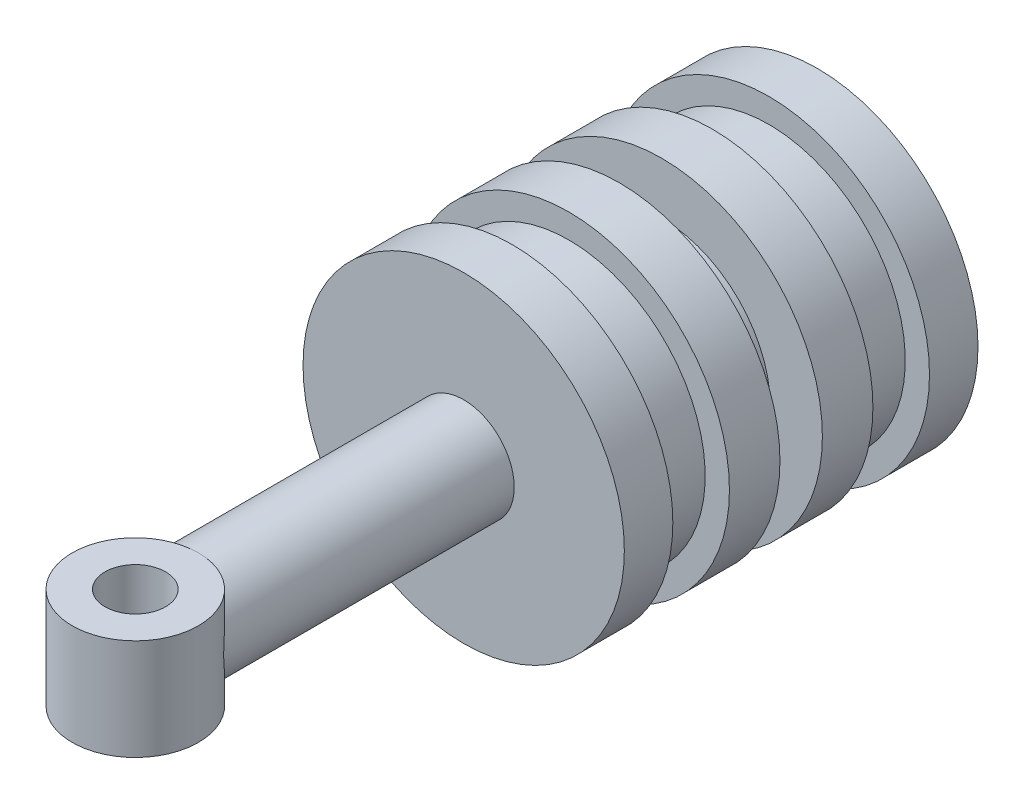
ISO-10303-21;
HEADER;
FILE_DESCRIPTION(('STEP AP214'),'2;1');
FILE_NAME('part.step','',(''),(''),'','','');
FILE_SCHEMA(('AUTOMOTIVE_DESIGN { 1 0 10303 214 1 1 1 1 }'));
ENDSEC;
DATA;
#1=APPLICATION_CONTEXT('core data for automotive mechanical design processes');
#2=APPLICATION_PROTOCOL_DEFINITION('international standard','automotive_design',2000,#1);
#3=PRODUCT_CONTEXT('',#1,'mechanical');
#4=PRODUCT('Part','Part','',(#3));
#5=PRODUCT_RELATED_PRODUCT_CATEGORY('part','',(#4));
#6=PRODUCT_DEFINITION_FORMATION('','',#4);
#7=PRODUCT_DEFINITION_CONTEXT('part definition',#1,'design');
#8=PRODUCT_DEFINITION('design','',#6,#7);
#9=PRODUCT_DEFINITION_SHAPE('','',#8);
#10=(LENGTH_UNIT() NAMED_UNIT(*) SI_UNIT(.MILLI.,.METRE.));
#11=(NAMED_UNIT(*) PLANE_ANGLE_UNIT() SI_UNIT($,.RADIAN.));
#12=(NAMED_UNIT(*) SI_UNIT($,.STERADIAN.) SOLID_ANGLE_UNIT());
#13=UNCERTAINTY_MEASURE_WITH_UNIT(LENGTH_MEASURE(1.E-05),#10,'distance_accuracy_value','');
#14=(GEOMETRIC_REPRESENTATION_CONTEXT(3) GLOBAL_UNCERTAINTY_ASSIGNED_CONTEXT((#13)) GLOBAL_UNIT_ASSIGNED_CONTEXT((#10,
#11,#12)) REPRESENTATION_CONTEXT('',''));
#15=CARTESIAN_POINT('',(0.,0.,0.));
#16=DIRECTION('',(0.,0.,1.));
#17=DIRECTION('',(1.,0.,0.));
#18=AXIS2_PLACEMENT_3D('',#15,#16,#17);
#19=CARTESIAN_POINT('',(0.,0.,35.));
#20=DIRECTION('',(0.,0.,-1.));
#21=DIRECTION('',(-1.,0.,0.));
#22=AXIS2_PLACEMENT_3D('',#19,#20,#21);
#23=CYLINDRICAL_SURFACE('',#22,15.9);
#24=CARTESIAN_POINT('',(0.,0.,30.2));
#25=DIRECTION('',(0.,0.,-1.));
#26=DIRECTION('',(-1.,0.,0.));
#27=AXIS2_PLACEMENT_3D('',#24,#25,#26);
#28=CIRCLE('',#27,15.9);
#29=CARTESIAN_POINT('',(-15.9,0.,30.2));
#30=VERTEX_POINT('',#29);
#31=EDGE_CURVE('E86',#30,#30,#28,.T.);
#32=ORIENTED_EDGE('',*,*,#31,.F.);
#33=EDGE_LOOP('',(#32));
#34=FACE_BOUND('',#33,.T.);
#35=CARTESIAN_POINT('',(0.,0.,35.));
#36=DIRECTION('',(0.,0.,1.));
#37=DIRECTION('',(1.,0.,0.));
#38=AXIS2_PLACEMENT_3D('',#35,#36,#37);
#39=CIRCLE('',#38,15.9);
#40=CARTESIAN_POINT('',(15.9,0.,35.));
#41=VERTEX_POINT('',#40);
#42=EDGE_CURVE('E59',#41,#41,#39,.T.);
#43=ORIENTED_EDGE('',*,*,#42,.F.);
#44=EDGE_LOOP('',(#43));
#45=FACE_BOUND('',#44,.T.);
#46=ADVANCED_FACE('F33',(#34,#45),#23,.T.);
#47=CARTESIAN_POINT('',(0.,0.,35.));
#48=DIRECTION('',(0.,0.,1.));
#49=DIRECTION('',(1.,0.,0.));
#50=AXIS2_PLACEMENT_3D('',#47,#48,#49);
#51=PLANE('',#50);
#52=CARTESIAN_POINT('',(0.,0.,35.));
#53=DIRECTION('',(0.,0.,1.));
#54=DIRECTION('',(1.,0.,0.));
#55=AXIS2_PLACEMENT_3D('',#52,#53,#54);
#56=CIRCLE('',#55,5.);
#57=CARTESIAN_POINT('',(5.,0.,35.));
#58=VERTEX_POINT('',#57);
#59=EDGE_CURVE('E66',#58,#58,#56,.T.);
#60=ORIENTED_EDGE('',*,*,#59,.F.);
#61=EDGE_LOOP('',(#60));
#62=FACE_BOUND('',#61,.T.);
#63=ORIENTED_EDGE('',*,*,#42,.T.);
#64=EDGE_LOOP('',(#63));
#65=FACE_BOUND('',#64,.T.);
#66=ADVANCED_FACE('F129',(#62,#65),#51,.T.);
#67=CARTESIAN_POINT('',(0.,0.,67.5));
#68=DIRECTION('',(0.,0.,-1.));
#69=DIRECTION('',(-1.,0.,0.));
#70=AXIS2_PLACEMENT_3D('',#67,#68,#69);
#71=CYLINDRICAL_SURFACE('',#70,5.);
#72=CARTESIAN_POINT('',(-5.,0.,63.75));
#73=CARTESIAN_POINT('',(-4.99999885776854,0.0938909121280883,63.7499973081609));
#74=CARTESIAN_POINT('',(-4.99734670933994,0.187818115057777,63.7464529538053));
#75=CARTESIAN_POINT('',(-4.98680893324889,0.374886191730902,63.7324675951416));
#76=CARTESIAN_POINT('',(-4.97891973687977,0.468026485386342,63.7220218880348));
#77=CARTESIAN_POINT('',(-4.9475977459603,0.745595294992632,63.6809642800992));
#78=CARTESIAN_POINT('',(-4.91651163359721,0.927784313885939,63.6406350111067));
#79=CARTESIAN_POINT('',(-4.82220555967727,1.34411299218025,63.5230538504446));
#80=CARTESIAN_POINT('',(-4.75156184089542,1.57422595928289,63.437832009276));
#81=CARTESIAN_POINT('',(-4.62456467956746,1.90457082100912,63.2952370729818));
#82=CARTESIAN_POINT('',(-4.57862927978183,2.01238855334762,63.2451455878447));
#83=CARTESIAN_POINT('',(-4.48005171018718,2.22321042709765,63.1414753582653));
#84=CARTESIAN_POINT('',(-4.42740971059429,2.32621469058625,63.0878967023456));
#85=CARTESIAN_POINT('',(-4.29548894563003,2.56385500503684,62.9587890723642));
#86=CARTESIAN_POINT('',(-4.21346186289867,2.69645950010586,62.8823290393125));
#87=CARTESIAN_POINT('',(-4.03784646504337,2.95295736189495,62.7280005243627));
#88=CARTESIAN_POINT('',(-3.9442540003352,3.07684757682343,62.6501315455475));
#89=CARTESIAN_POINT('',(-3.74576821400209,3.31561348088606,62.4952472866746));
#90=CARTESIAN_POINT('',(-3.64088402891136,3.43049633002819,62.4182313712058));
#91=CARTESIAN_POINT('',(-3.41992453564337,3.65081586565111,62.2669742826729));
#92=CARTESIAN_POINT('',(-3.30385297537724,3.7562556929828,62.1927321918292));
#93=CARTESIAN_POINT('',(-2.98698129618399,4.01770521655216,62.00529394231));
#94=CARTESIAN_POINT('',(-2.77734343594186,4.16580191198478,61.8956483278007));
#95=CARTESIAN_POINT('',(-2.33110287063702,4.43092867304237,61.6958558634472));
#96=CARTESIAN_POINT('',(-2.09454289784749,4.54800701609557,61.605678753517));
#97=CARTESIAN_POINT('',(-1.63825553265416,4.72928395602096,61.4646094140582));
#98=CARTESIAN_POINT('',(-1.42199095603612,4.7989718062838,61.409722782913));
#99=CARTESIAN_POINT('',(-1.08892644602,4.88133006232806,61.3445459029042));
#100=CARTESIAN_POINT('',(-0.976426200543212,4.90509092674096,61.3256761164386));
#101=CARTESIAN_POINT('',(-0.749241947685171,4.9448872184596,61.2940141352562));
#102=CARTESIAN_POINT('',(-0.634558831002432,4.96092572940565,61.2812195146718));
#103=CARTESIAN_POINT('',(-0.403377862628112,4.9850627919024,61.2619475141728));
#104=CARTESIAN_POINT('',(-0.2868746670593,4.99313003938863,61.2554950411153));
#105=CARTESIAN_POINT('',(-0.0534531282249481,5.00107713254313,61.2491387379326));
#106=CARTESIAN_POINT('',(0.0634650378783883,5.00096013016443,61.2492323867372));
#107=CARTESIAN_POINT('',(0.296842188418757,4.9925466969948,61.2559615441378));
#108=CARTESIAN_POINT('',(0.413301062359628,4.98424840569189,61.2625985407606));
#109=CARTESIAN_POINT('',(0.644812748445618,4.95961377976366,61.2822661663841));
#110=CARTESIAN_POINT('',(0.759865592958058,4.94327763053139,61.2952966479193));
#111=CARTESIAN_POINT('',(0.981474236561891,4.90394410776025,61.3265865517878));
#112=CARTESIAN_POINT('',(1.08815007796496,4.88136100710092,61.344520155582));
#113=CARTESIAN_POINT('',(1.29888631268514,4.82956362857264,61.3855141850756));
#114=CARTESIAN_POINT('',(1.40294584855837,4.80034720743126,61.408576267773));
#115=CARTESIAN_POINT('',(1.71032012431078,4.70328513476782,61.484871450709));
#116=CARTESIAN_POINT('',(1.90898248120982,4.62599905281922,61.5452357374501));
#117=CARTESIAN_POINT('',(2.30885291672158,4.44099009511886,61.6878504440572));
#118=CARTESIAN_POINT('',(2.50846273717733,4.33105241404328,61.7716490084334));
#119=CARTESIAN_POINT('',(2.88675877163216,4.08866165047536,61.9526432557263));
#120=CARTESIAN_POINT('',(3.06543317755297,3.9561959639103,62.0498464325282));
#121=CARTESIAN_POINT('',(3.43568643777754,3.64232477957931,62.2736822682867));
#122=CARTESIAN_POINT('',(3.62233632458499,3.45645946483804,62.4022516016567));
#123=CARTESIAN_POINT('',(3.87813118628421,3.15867858890175,62.5975321634981));
#124=CARTESIAN_POINT('',(3.95943569994801,3.05614178292555,62.6630972698389));
#125=CARTESIAN_POINT('',(4.1138869497086,2.84482944206537,62.7937658551653));
#126=CARTESIAN_POINT('',(4.18703643298518,2.73605602691611,62.8588694826462));
#127=CARTESIAN_POINT('',(4.31836696268312,2.52305730917826,62.9809889300666));
#128=CARTESIAN_POINT('',(4.37731105597635,2.41940186446675,63.0381800963905));
#129=CARTESIAN_POINT('',(4.48819574120567,2.20691300059455,63.1497379003471));
#130=CARTESIAN_POINT('',(4.54013553201454,2.09807899105066,63.2041042144469));
#131=CARTESIAN_POINT('',(4.63656712179329,1.87534881116151,63.3083679700686));
#132=CARTESIAN_POINT('',(4.68107295642902,1.76146270619007,63.3582737484995));
#133=CARTESIAN_POINT('',(4.76224687185455,1.52847811677113,63.4518721241536));
#134=CARTESIAN_POINT('',(4.79891550282078,1.40937999891771,63.4955651574432));
#135=CARTESIAN_POINT('',(4.87654260263037,1.11805113331106,63.5901480895598));
#136=CARTESIAN_POINT('',(4.9135087632456,0.943358258017732,63.6371016538756));
#137=CARTESIAN_POINT('',(4.95491332357023,0.676006275841126,63.6905601440474));
#138=CARTESIAN_POINT('',(4.96637163811242,0.586053962600714,63.7055474454248));
#139=CARTESIAN_POINT('',(4.98441232505839,0.404853969991468,63.7292758528003));
#140=CARTESIAN_POINT('',(4.99099669354517,0.313606836526637,63.7380195157752));
#141=CARTESIAN_POINT('',(4.99916204287713,0.129934320650779,63.7488767027435));
#142=CARTESIAN_POINT('',(5.00071229993887,0.0375051467690409,63.7509495130431));
#143=CARTESIAN_POINT('',(4.99868609693304,-0.147194255876783,63.7482484155474));
#144=CARTESIAN_POINT('',(4.99510971876763,-0.239464487156529,63.7434746171322));
#145=CARTESIAN_POINT('',(4.9829117601292,-0.423172199262351,63.7273097953386));
#146=CARTESIAN_POINT('',(4.97428511407082,-0.514608750227715,63.7159121280849));
#147=CARTESIAN_POINT('',(4.95217190850216,-0.69594937987068,63.6870192933819));
#148=CARTESIAN_POINT('',(4.93868271191038,-0.785852599223036,63.6695208174825));
#149=CARTESIAN_POINT('',(4.90309041843423,-0.986158953196056,63.6240180219868));
#150=CARTESIAN_POINT('',(4.87967032459779,-1.09597832920207,63.5944747605687));
#151=CARTESIAN_POINT('',(4.82611007179474,-1.3118893837054,63.5284809400452));
#152=CARTESIAN_POINT('',(4.7959643989901,-1.41797792045756,63.4920247171809));
#153=CARTESIAN_POINT('',(4.72936837350411,-1.62636694260485,63.4136540897397));
#154=CARTESIAN_POINT('',(4.69290326417036,-1.72865786564984,63.371726967865));
#155=CARTESIAN_POINT('',(4.61412316301251,-1.92910908771271,63.2838581881536));
#156=CARTESIAN_POINT('',(4.5718098813598,-2.02727058338596,63.2379177053773));
#157=CARTESIAN_POINT('',(4.46094321234326,-2.26362042726529,63.121465532496));
#158=CARTESIAN_POINT('',(4.38924853156728,-2.39954685210881,63.0493381081835));
#159=CARTESIAN_POINT('',(4.23457314886351,-2.66303150621354,62.9019216668441));
#160=CARTESIAN_POINT('',(4.15158781275427,-2.79058626734123,62.8266313604483));
#161=CARTESIAN_POINT('',(3.97454783075512,-3.03744251731677,62.6751625183398));
#162=CARTESIAN_POINT('',(3.8804823499348,-3.15673574344032,62.5989831799438));
#163=CARTESIAN_POINT('',(3.68150470816857,-3.38668474854642,62.4478087073843));
#164=CARTESIAN_POINT('',(3.57659424574698,-3.49734187535162,62.3728133898959));
#165=CARTESIAN_POINT('',(3.35441565941585,-3.71106338566364,62.2247299126454));
#166=CARTESIAN_POINT('',(3.23699188403608,-3.81399611584031,62.1516845301473));
#167=CARTESIAN_POINT('',(2.99117872490278,-4.0096789070725,62.0104240297796));
#168=CARTESIAN_POINT('',(2.8627876306041,-4.10242737453963,61.9422096684379));
#169=CARTESIAN_POINT('',(2.59574592831791,-4.27637991424729,61.8125952891626));
#170=CARTESIAN_POINT('',(2.45712448023732,-4.35761500729524,61.7511770621685));
#171=CARTESIAN_POINT('',(2.16997261450434,-4.5074835546874,61.6367614277738));
#172=CARTESIAN_POINT('',(2.02144787261769,-4.57612414396938,61.5837592548826));
#173=CARTESIAN_POINT('',(1.76492819384473,-4.67947808968283,61.5033900313618));
#174=CARTESIAN_POINT('',(1.65930961072495,-4.71799398187293,61.473268166866));
#175=CARTESIAN_POINT('',(1.44450170687178,-4.78812800921112,61.4182077566796));
#176=CARTESIAN_POINT('',(1.33531332421423,-4.81974793999856,61.3932678617362));
#177=CARTESIAN_POINT('',(1.11398365445547,-4.87566047403246,61.3490429467621));
#178=CARTESIAN_POINT('',(1.0018432350158,-4.89995520472174,61.32975628492));
#179=CARTESIAN_POINT('',(0.775350554072117,-4.94085686748539,61.2972253993773));
#180=CARTESIAN_POINT('',(0.660999298308979,-4.95746721338013,61.2839784925281));
#181=CARTESIAN_POINT('',(0.430391309055678,-4.9827977106872,61.2637579880018));
#182=CARTESIAN_POINT('',(0.314128669773628,-4.99148510363712,61.2568104364971));
#183=CARTESIAN_POINT('',(0.0811160534365132,-5.00070092400079,61.2494398617139));
#184=CARTESIAN_POINT('',(-0.0356337252929444,-5.00123239879797,61.2490144015164));
#185=CARTESIAN_POINT('',(-0.268753221549166,-4.99413395707207,61.2546922045033));
#186=CARTESIAN_POINT('',(-0.385122837220166,-4.98650200866631,61.2607970930969));
#187=CARTESIAN_POINT('',(-0.616532221858692,-4.96320588365727,61.2794000536248));
#188=CARTESIAN_POINT('',(-0.731572019884697,-4.94754188290674,61.2918979855905));
#189=CARTESIAN_POINT('',(-0.953341026475231,-4.90949148815424,61.3221782909021));
#190=CARTESIAN_POINT('',(-1.06018432647381,-4.88751218521298,61.3396401175662));
#191=CARTESIAN_POINT('',(-1.27130826632504,-4.83689742668508,61.3797189259644));
#192=CARTESIAN_POINT('',(-1.37558806311351,-4.80825981291007,61.4023375791577));
#193=CARTESIAN_POINT('',(-1.68369098413994,-4.71288908105618,61.4773542101788));
#194=CARTESIAN_POINT('',(-1.88292934774763,-4.63667140163434,61.536934355804));
#195=CARTESIAN_POINT('',(-2.28349369563391,-4.4540557103209,61.677850714138));
#196=CARTESIAN_POINT('',(-2.48328867653825,-4.34550924715391,61.760695524029));
#197=CARTESIAN_POINT('',(-2.86214643984582,-4.10590030810172,61.9399096477803));
#198=CARTESIAN_POINT('',(-3.04119812979179,-3.97482587759464,62.036286137323));
#199=CARTESIAN_POINT('',(-3.41222862690789,-3.66423938211919,62.2583479801055));
#200=CARTESIAN_POINT('',(-3.59935209061758,-3.48030432946373,62.3859946688966));
#201=CARTESIAN_POINT('',(-3.8560900230879,-3.18552648929621,62.5801761069556));
#202=CARTESIAN_POINT('',(-3.93774852950271,-3.08400911185625,62.6454224978092));
#203=CARTESIAN_POINT('',(-4.09299174094679,-2.87478361084799,62.7755790823393));
#204=CARTESIAN_POINT('',(-4.16657907830005,-2.76707752322861,62.8404893790093));
#205=CARTESIAN_POINT('',(-4.2999149098764,-2.55444394985237,62.9633953196921));
#206=CARTESIAN_POINT('',(-4.36030095263224,-2.44999359645524,63.0215262654136));
#207=CARTESIAN_POINT('',(-4.47391805762078,-2.2357907008463,63.1350256241207));
#208=CARTESIAN_POINT('',(-4.52714816300485,-2.12603745222542,63.1903936670465));
#209=CARTESIAN_POINT('',(-4.62602027059307,-1.90130754201403,63.296703911465));
#210=CARTESIAN_POINT('',(-4.67167429879959,-1.78633953486605,63.3476530647651));
#211=CARTESIAN_POINT('',(-4.75498040266405,-1.55105183226487,63.4433164719506));
#212=CARTESIAN_POINT('',(-4.79263299384948,-1.43073248219968,63.4880311274567));
#213=CARTESIAN_POINT('',(-4.87283888541302,-1.13466670982135,63.5854861299422));
#214=CARTESIAN_POINT('',(-4.91115742606527,-0.95627943259438,63.6340945520529));
#215=CARTESIAN_POINT('',(-4.95395682367111,-0.683231479469128,63.6893120518887));
#216=CARTESIAN_POINT('',(-4.96577122200141,-0.591423017509349,63.7047603525609));
#217=CARTESIAN_POINT('',(-4.98431628790816,-0.406454017555133,63.729146960256));
#218=CARTESIAN_POINT('',(-4.9910505150804,-0.313294472979369,63.7380898253779));
#219=CARTESIAN_POINT('',(-4.9967745212159,-0.183272598373473,63.7457025957117));
#220=CARTESIAN_POINT('',(-4.9979832705403,-0.146651464450568,63.7473122630909));
#221=CARTESIAN_POINT('',(-4.99959628542302,-0.0733554042215833,63.7494615607069));
#222=CARTESIAN_POINT('',(-5.00000044623689,-0.0366804715336283,63.7500010516239));
#223=CARTESIAN_POINT('',(-5.,0.,63.75));
#224=B_SPLINE_CURVE_WITH_KNOTS('',3,(#72,#73,#74,#75,#76,#77,#78,#79,#80,#81,#82,#83,#84,#85,
#86,#87,#88,#89,#90,#91,#92,#93,#94,#95,#96,#97,#98,#99,#100,#101,#102,#103,#104,#105,#106,#107,
#108,#109,#110,#111,#112,#113,#114,#115,#116,#117,#118,#119,#120,#121,#122,#123,#124,#125,#126,
#127,#128,#129,#130,#131,#132,#133,#134,#135,#136,#137,#138,#139,#140,#141,#142,#143,#144,#145,
#146,#147,#148,#149,#150,#151,#152,#153,#154,#155,#156,#157,#158,#159,#160,#161,#162,#163,#164,
#165,#166,#167,#168,#169,#170,#171,#172,#173,#174,#175,#176,#177,#178,#179,#180,#181,#182,#183,
#184,#185,#186,#187,#188,#189,#190,#191,#192,#193,#194,#195,#196,#197,#198,#199,#200,#201,#202,
#203,#204,#205,#206,#207,#208,#209,#210,#211,#212,#213,#214,#215,#216,#217,#218,#219,#220,#221,
#222,#223),.UNSPECIFIED.,.T.,.F.,(4,2,2,2,2,2,2,2,2,2,2,2,2,2,2,2,2,2,2,2,2,2,2,2,2,2,2,2,2,2,2,
2,2,2,2,2,2,2,2,2,2,2,2,2,2,2,2,2,2,2,2,2,2,2,2,2,2,2,2,2,2,2,2,2,2,2,2,2,2,2,2,2,2,2,2,4),(0.,
0.281628937259038,0.563449983547842,1.12823692125194,1.88988389816645,2.27203139952482,
2.65416920376134,3.17449992266736,3.69501787790485,4.21511778463936,4.73504405302965,
5.56894529408517,6.40154091088344,7.09951507548731,7.44870625029767,7.7977578724657,
8.1481748761284,8.49845692645113,8.84881865300957,9.19917229885943,9.53031911688957,
9.86157308343547,10.5236180437687,11.2494379131137,11.9756652115568,12.851555809563,
13.2903845925581,13.729065098025,14.1255244785052,14.5220291662101,14.9177765582387,
15.3134961594298,15.8649717831253,16.1404095876455,16.4157345264591,16.6927366789302,
16.9697344061161,17.2470104483501,17.5244370910357,17.8722257062004,18.2203005038991,
18.5691993286307,18.9179963404793,19.4265666676372,19.9353463676988,20.444627783746,
20.9538295574218,21.4703341522273,21.9869194525606,22.5020853075807,23.016958407742,
23.3657875933345,23.7145258385596,24.0631627026757,24.411644534308,24.7615607613759,
25.1113462422951,25.4612188053678,25.8110837087009,26.1421222270667,26.4732681964014,
27.1350986921874,27.8585161178742,28.5823186220223,29.4542701232434,29.8911301515057,
30.3278472762859,30.7293234010043,31.1308531553969,31.5317393088281,31.9325996255837,
32.4964891390052,32.7777284959375,33.0587706093853,33.1687805923398,33.2788048958856),.UNSPECIFIED.);
#225=CARTESIAN_POINT('',(0.,-5.,61.25));
#226=VERTEX_POINT('',#225);
#227=CARTESIAN_POINT('',(0.,5.,61.25));
#228=VERTEX_POINT('',#227);
#229=EDGE_CURVE('E37',#226,#228,#224,.T.);
#230=ORIENTED_EDGE('',*,*,#229,.T.);
#231=EDGE_CURVE('E11',#228,#226,#224,.T.);
#232=ORIENTED_EDGE('',*,*,#231,.T.);
#233=EDGE_LOOP('',(#230,#232));
#234=FACE_BOUND('',#233,.T.);
#235=ORIENTED_EDGE('',*,*,#59,.T.);
#236=EDGE_LOOP('',(#235));
#237=FACE_BOUND('',#236,.T.);
#238=ADVANCED_FACE('F135',(#234,#237),#71,.T.);
#239=CARTESIAN_POINT('',(0.,15.9,30.2));
#240=DIRECTION('',(0.,0.,1.));
#241=DIRECTION('',(1.,0.,0.));
#242=AXIS2_PLACEMENT_3D('',#239,#240,#241);
#243=PLANE('',#242);
#244=CARTESIAN_POINT('',(0.,0.,30.2));
#245=DIRECTION('',(0.,0.,-1.));
#246=DIRECTION('',(-1.,0.,0.));
#247=AXIS2_PLACEMENT_3D('',#244,#245,#246);
#248=CIRCLE('',#247,13.5);
#249=CARTESIAN_POINT('',(-13.5,0.,30.2));
#250=VERTEX_POINT('',#249);
#251=EDGE_CURVE('E82',#250,#250,#248,.T.);
#252=ORIENTED_EDGE('',*,*,#251,.F.);
#253=EDGE_LOOP('',(#252));
#254=FACE_BOUND('',#253,.T.);
#255=ORIENTED_EDGE('',*,*,#31,.T.);
#256=EDGE_LOOP('',(#255));
#257=FACE_BOUND('',#256,.T.);
#258=ADVANCED_FACE('F181',(#254,#257),#243,.F.);
#259=CARTESIAN_POINT('',(0.,0.,-11.9984929271487));
#260=DIRECTION('',(0.,0.,-1.));
#261=DIRECTION('',(-1.,0.,0.));
#262=AXIS2_PLACEMENT_3D('',#259,#260,#261);
#263=CYLINDRICAL_SURFACE('',#262,13.5);
#264=CARTESIAN_POINT('',(0.,0.,24.6));
#265=DIRECTION('',(0.,0.,-1.));
#266=DIRECTION('',(-1.,0.,0.));
#267=AXIS2_PLACEMENT_3D('',#264,#265,#266);
#268=CIRCLE('',#267,13.5);
#269=CARTESIAN_POINT('',(-13.5,0.,24.6));
#270=VERTEX_POINT('',#269);
#271=EDGE_CURVE('E98',#270,#270,#268,.T.);
#272=ORIENTED_EDGE('',*,*,#271,.F.);
#273=EDGE_LOOP('',(#272));
#274=FACE_BOUND('',#273,.T.);
#275=ORIENTED_EDGE('',*,*,#251,.T.);
#276=EDGE_LOOP('',(#275));
#277=FACE_BOUND('',#276,.T.);
#278=ADVANCED_FACE('F175',(#274,#277),#263,.T.);
#279=CARTESIAN_POINT('',(0.,15.9,24.6));
#280=DIRECTION('',(0.,0.,-1.));
#281=DIRECTION('',(-1.,0.,0.));
#282=AXIS2_PLACEMENT_3D('',#279,#280,#281);
#283=PLANE('',#282);
#284=CARTESIAN_POINT('',(0.,0.,24.6));
#285=DIRECTION('',(0.,0.,-1.));
#286=DIRECTION('',(-1.,0.,0.));
#287=AXIS2_PLACEMENT_3D('',#284,#285,#286);
#288=CIRCLE('',#287,15.9);
#289=CARTESIAN_POINT('',(-15.9,0.,24.6));
#290=VERTEX_POINT('',#289);
#291=EDGE_CURVE('E101',#290,#290,#288,.T.);
#292=ORIENTED_EDGE('',*,*,#291,.F.);
#293=EDGE_LOOP('',(#292));
#294=FACE_BOUND('',#293,.T.);
#295=ORIENTED_EDGE('',*,*,#271,.T.);
#296=EDGE_LOOP('',(#295));
#297=FACE_BOUND('',#296,.T.);
#298=ADVANCED_FACE('F165',(#294,#297),#283,.F.);
#299=CARTESIAN_POINT('',(0.,15.9,19.6));
#300=DIRECTION('',(0.,0.,1.));
#301=DIRECTION('',(1.,0.,0.));
#302=AXIS2_PLACEMENT_3D('',#299,#300,#301);
#303=PLANE('',#302);
#304=CARTESIAN_POINT('',(0.,0.,19.6));
#305=DIRECTION('',(0.,0.,-1.));
#306=DIRECTION('',(-1.,0.,0.));
#307=AXIS2_PLACEMENT_3D('',#304,#305,#306);
#308=CIRCLE('',#307,10.75);
#309=CARTESIAN_POINT('',(-10.75,0.,19.6));
#310=VERTEX_POINT('',#309);
#311=EDGE_CURVE('E70',#310,#310,#308,.T.);
#312=ORIENTED_EDGE('',*,*,#311,.F.);
#313=EDGE_LOOP('',(#312));
#314=FACE_BOUND('',#313,.T.);
#315=CARTESIAN_POINT('',(0.,0.,19.6));
#316=DIRECTION('',(0.,0.,-1.));
#317=DIRECTION('',(-1.,0.,0.));
#318=AXIS2_PLACEMENT_3D('',#315,#316,#317);
#319=CIRCLE('',#318,15.9);
#320=CARTESIAN_POINT('',(-15.9,0.,19.6));
#321=VERTEX_POINT('',#320);
#322=EDGE_CURVE('E79',#321,#321,#319,.T.);
#323=ORIENTED_EDGE('',*,*,#322,.T.);
#324=EDGE_LOOP('',(#323));
#325=FACE_BOUND('',#324,.T.);
#326=ADVANCED_FACE('F157',(#314,#325),#303,.F.);
#327=ORIENTED_EDGE('',*,*,#291,.T.);
#328=EDGE_LOOP('',(#327));
#329=FACE_BOUND('',#328,.T.);
#330=ORIENTED_EDGE('',*,*,#322,.F.);
#331=EDGE_LOOP('',(#330));
#332=FACE_BOUND('',#331,.T.);
#333=ADVANCED_FACE('F144',(#329,#332),#23,.T.);
#334=CARTESIAN_POINT('',(0.,0.,-11.9984929271487));
#335=DIRECTION('',(0.,0.,-1.));
#336=DIRECTION('',(-1.,0.,0.));
#337=AXIS2_PLACEMENT_3D('',#334,#335,#336);
#338=CYLINDRICAL_SURFACE('',#337,10.75);
#339=CARTESIAN_POINT('',(0.,0.,15.4));
#340=DIRECTION('',(0.,0.,-1.));
#341=DIRECTION('',(-1.,0.,0.));
#342=AXIS2_PLACEMENT_3D('',#339,#340,#341);
#343=CIRCLE('',#342,10.75);
#344=CARTESIAN_POINT('',(-10.75,0.,15.4));
#345=VERTEX_POINT('',#344);
#346=EDGE_CURVE('E73',#345,#345,#343,.T.);
#347=ORIENTED_EDGE('',*,*,#346,.F.);
#348=EDGE_LOOP('',(#347));
#349=FACE_BOUND('',#348,.T.);
#350=ORIENTED_EDGE('',*,*,#311,.T.);
#351=EDGE_LOOP('',(#350));
#352=FACE_BOUND('',#351,.T.);
#353=ADVANCED_FACE('F156',(#349,#352),#338,.T.);
#354=CARTESIAN_POINT('',(0.,15.9,15.4));
#355=DIRECTION('',(0.,0.,-1.));
#356=DIRECTION('',(-1.,0.,0.));
#357=AXIS2_PLACEMENT_3D('',#354,#355,#356);
#358=PLANE('',#357);
#359=CARTESIAN_POINT('',(0.,0.,15.4));
#360=DIRECTION('',(0.,0.,-1.));
#361=DIRECTION('',(-1.,0.,0.));
#362=AXIS2_PLACEMENT_3D('',#359,#360,#361);
#363=CIRCLE('',#362,15.9);
#364=CARTESIAN_POINT('',(-15.9,0.,15.4));
#365=VERTEX_POINT('',#364);
#366=EDGE_CURVE('E76',#365,#365,#363,.T.);
#367=ORIENTED_EDGE('',*,*,#366,.F.);
#368=EDGE_LOOP('',(#367));
#369=FACE_BOUND('',#368,.T.);
#370=ORIENTED_EDGE('',*,*,#346,.T.);
#371=EDGE_LOOP('',(#370));
#372=FACE_BOUND('',#371,.T.);
#373=ADVANCED_FACE('F142',(#369,#372),#358,.F.);
#374=CARTESIAN_POINT('',(0.,0.,10.4));
#375=DIRECTION('',(0.,0.,-1.));
#376=DIRECTION('',(-1.,0.,0.));
#377=AXIS2_PLACEMENT_3D('',#374,#375,#376);
#378=CIRCLE('',#377,15.9);
#379=CARTESIAN_POINT('',(-15.9,0.,10.4));
#380=VERTEX_POINT('',#379);
#381=EDGE_CURVE('E93',#380,#380,#378,.T.);
#382=ORIENTED_EDGE('',*,*,#381,.F.);
#383=EDGE_LOOP('',(#382));
#384=FACE_BOUND('',#383,.T.);
#385=ORIENTED_EDGE('',*,*,#366,.T.);
#386=EDGE_LOOP('',(#385));
#387=FACE_BOUND('',#386,.T.);
#388=ADVANCED_FACE('F131',(#384,#387),#23,.T.);
#389=CARTESIAN_POINT('',(0.,15.9,10.4));
#390=DIRECTION('',(0.,0.,1.));
#391=DIRECTION('',(1.,0.,0.));
#392=AXIS2_PLACEMENT_3D('',#389,#390,#391);
#393=PLANE('',#392);
#394=CARTESIAN_POINT('',(0.,0.,10.4));
#395=DIRECTION('',(0.,0.,-1.));
#396=DIRECTION('',(-1.,0.,0.));
#397=AXIS2_PLACEMENT_3D('',#394,#395,#396);
#398=CIRCLE('',#397,13.5);
#399=CARTESIAN_POINT('',(-13.5,0.,10.4));
#400=VERTEX_POINT('',#399);
#401=EDGE_CURVE('E83',#400,#400,#398,.T.);
#402=ORIENTED_EDGE('',*,*,#401,.F.);
#403=EDGE_LOOP('',(#402));
#404=FACE_BOUND('',#403,.T.);
#405=ORIENTED_EDGE('',*,*,#381,.T.);
#406=EDGE_LOOP('',(#405));
#407=FACE_BOUND('',#406,.T.);
#408=ADVANCED_FACE('F141',(#404,#407),#393,.F.);
#409=CARTESIAN_POINT('',(0.,0.,-11.9984929271487));
#410=DIRECTION('',(0.,0.,-1.));
#411=DIRECTION('',(-1.,0.,0.));
#412=AXIS2_PLACEMENT_3D('',#409,#410,#411);
#413=CYLINDRICAL_SURFACE('',#412,13.5);
#414=CARTESIAN_POINT('',(0.,0.,4.8));
#415=DIRECTION('',(0.,0.,-1.));
#416=DIRECTION('',(-1.,0.,0.));
#417=AXIS2_PLACEMENT_3D('',#414,#415,#416);
#418=CIRCLE('',#417,13.5);
#419=CARTESIAN_POINT('',(-13.5,0.,4.8));
#420=VERTEX_POINT('',#419);
#421=EDGE_CURVE('E87',#420,#420,#418,.T.);
#422=ORIENTED_EDGE('',*,*,#421,.F.);
#423=EDGE_LOOP('',(#422));
#424=FACE_BOUND('',#423,.T.);
#425=ORIENTED_EDGE('',*,*,#401,.T.);
#426=EDGE_LOOP('',(#425));
#427=FACE_BOUND('',#426,.T.);
#428=ADVANCED_FACE('F194',(#424,#427),#413,.T.);
#429=CARTESIAN_POINT('',(0.,15.9,4.8));
#430=DIRECTION('',(0.,0.,-1.));
#431=DIRECTION('',(-1.,0.,0.));
#432=AXIS2_PLACEMENT_3D('',#429,#430,#431);
#433=PLANE('',#432);
#434=CARTESIAN_POINT('',(0.,0.,4.8));
#435=DIRECTION('',(0.,0.,-1.));
#436=DIRECTION('',(-1.,0.,0.));
#437=AXIS2_PLACEMENT_3D('',#434,#435,#436);
#438=CIRCLE('',#437,15.9);
#439=CARTESIAN_POINT('',(-15.9,0.,4.8));
#440=VERTEX_POINT('',#439);
#441=EDGE_CURVE('E90',#440,#440,#438,.T.);
#442=ORIENTED_EDGE('',*,*,#441,.F.);
#443=EDGE_LOOP('',(#442));
#444=FACE_BOUND('',#443,.T.);
#445=ORIENTED_EDGE('',*,*,#421,.T.);
#446=EDGE_LOOP('',(#445));
#447=FACE_BOUND('',#446,.T.);
#448=ADVANCED_FACE('F152',(#444,#447),#433,.F.);
#449=CARTESIAN_POINT('',(0.,0.,0.));
#450=DIRECTION('',(0.,0.,1.));
#451=DIRECTION('',(1.,0.,0.));
#452=AXIS2_PLACEMENT_3D('',#449,#450,#451);
#453=PLANE('',#452);
#454=CARTESIAN_POINT('',(0.,0.,0.));
#455=DIRECTION('',(0.,0.,1.));
#456=DIRECTION('',(1.,0.,0.));
#457=AXIS2_PLACEMENT_3D('',#454,#455,#456);
#458=CIRCLE('',#457,15.9);
#459=CARTESIAN_POINT('',(15.9,0.,0.));
#460=VERTEX_POINT('',#459);
#461=EDGE_CURVE('E61',#460,#460,#458,.T.);
#462=ORIENTED_EDGE('',*,*,#461,.F.);
#463=EDGE_LOOP('',(#462));
#464=FACE_BOUND('',#463,.T.);
#465=ADVANCED_FACE('F146',(#464),#453,.F.);
#466=ORIENTED_EDGE('',*,*,#441,.T.);
#467=EDGE_LOOP('',(#466));
#468=FACE_BOUND('',#467,.T.);
#469=ORIENTED_EDGE('',*,*,#461,.T.);
#470=EDGE_LOOP('',(#469));
#471=FACE_BOUND('',#470,.T.);
#472=ADVANCED_FACE('F35',(#468,#471),#23,.T.);
#473=CARTESIAN_POINT('',(0.,-5.,67.5));
#474=DIRECTION('',(0.,1.,0.));
#475=DIRECTION('',(0.,0.,1.));
#476=AXIS2_PLACEMENT_3D('',#473,#474,#475);
#477=CYLINDRICAL_SURFACE('',#476,6.25);
#478=ORIENTED_EDGE('',*,*,#231,.F.);
#479=CARTESIAN_POINT('',(0.,5.,67.5));
#480=DIRECTION('',(0.,1.,0.));
#481=DIRECTION('',(0.,0.,1.));
#482=AXIS2_PLACEMENT_3D('',#479,#480,#481);
#483=CIRCLE('',#482,6.25);
#484=EDGE_CURVE('E52',#228,#228,#483,.T.);
#485=ORIENTED_EDGE('',*,*,#484,.F.);
#486=ORIENTED_EDGE('',*,*,#229,.F.);
#487=CARTESIAN_POINT('',(0.,-5.,67.5));
#488=DIRECTION('',(0.,1.,0.));
#489=DIRECTION('',(0.,0.,1.));
#490=AXIS2_PLACEMENT_3D('',#487,#488,#489);
#491=CIRCLE('',#490,6.25);
#492=EDGE_CURVE('E57',#226,#226,#491,.T.);
#493=ORIENTED_EDGE('',*,*,#492,.T.);
#494=EDGE_LOOP('',(#478,#485,#486,#493));
#495=FACE_BOUND('',#494,.T.);
#496=ADVANCED_FACE('F55',(#495),#477,.T.);
#497=CARTESIAN_POINT('',(0.,-5.,67.5));
#498=DIRECTION('',(0.,1.,0.));
#499=DIRECTION('',(0.,0.,1.));
#500=AXIS2_PLACEMENT_3D('',#497,#498,#499);
#501=CYLINDRICAL_SURFACE('',#500,3.);
#502=CARTESIAN_POINT('',(0.,-5.,67.5));
#503=DIRECTION('',(0.,1.,0.));
#504=DIRECTION('',(0.,0.,1.));
#505=AXIS2_PLACEMENT_3D('',#502,#503,#504);
#506=CIRCLE('',#505,3.);
#507=CARTESIAN_POINT('',(0.,-5.,70.5));
#508=VERTEX_POINT('',#507);
#509=EDGE_CURVE('E107',#508,#508,#506,.T.);
#510=ORIENTED_EDGE('',*,*,#509,.F.);
#511=EDGE_LOOP('',(#510));
#512=FACE_BOUND('',#511,.T.);
#513=CARTESIAN_POINT('',(0.,5.,67.5));
#514=DIRECTION('',(0.,1.,0.));
#515=DIRECTION('',(0.,0.,1.));
#516=AXIS2_PLACEMENT_3D('',#513,#514,#515);
#517=CIRCLE('',#516,3.);
#518=CARTESIAN_POINT('',(0.,5.,70.5));
#519=VERTEX_POINT('',#518);
#520=EDGE_CURVE('E111',#519,#519,#517,.T.);
#521=ORIENTED_EDGE('',*,*,#520,.T.);
#522=EDGE_LOOP('',(#521));
#523=FACE_BOUND('',#522,.T.);
#524=ADVANCED_FACE('F115',(#512,#523),#501,.F.);
#525=CARTESIAN_POINT('',(0.,-5.,67.5));
#526=DIRECTION('',(0.,1.,0.));
#527=DIRECTION('',(0.,0.,1.));
#528=AXIS2_PLACEMENT_3D('',#525,#526,#527);
#529=PLANE('',#528);
#530=ORIENTED_EDGE('',*,*,#492,.F.);
#531=EDGE_LOOP('',(#530));
#532=FACE_BOUND('',#531,.T.);
#533=ORIENTED_EDGE('',*,*,#509,.T.);
#534=EDGE_LOOP('',(#533));
#535=FACE_BOUND('',#534,.T.);
#536=ADVANCED_FACE('F119',(#532,#535),#529,.F.);
#537=CARTESIAN_POINT('',(0.,5.,67.5));
#538=DIRECTION('',(0.,1.,0.));
#539=DIRECTION('',(0.,0.,1.));
#540=AXIS2_PLACEMENT_3D('',#537,#538,#539);
#541=PLANE('',#540);
#542=ORIENTED_EDGE('',*,*,#484,.T.);
#543=EDGE_LOOP('',(#542));
#544=FACE_BOUND('',#543,.T.);
#545=ORIENTED_EDGE('',*,*,#520,.F.);
#546=EDGE_LOOP('',(#545));
#547=FACE_BOUND('',#546,.T.);
#548=ADVANCED_FACE('F117',(#544,#547),#541,.T.);
#549=CLOSED_SHELL('',(#46,#66,#238,#258,#278,#298,#326,#333,#353,#373,#388,#408,#428,#448,#465,
#472,#496,#524,#536,#548));
#550=MANIFOLD_SOLID_BREP('B2',#549);
#551=ADVANCED_BREP_SHAPE_REPRESENTATION('',(#18,#550),#14);
#552=SHAPE_DEFINITION_REPRESENTATION(#9,#551);
ENDSEC;
END-ISO-10303-21;
